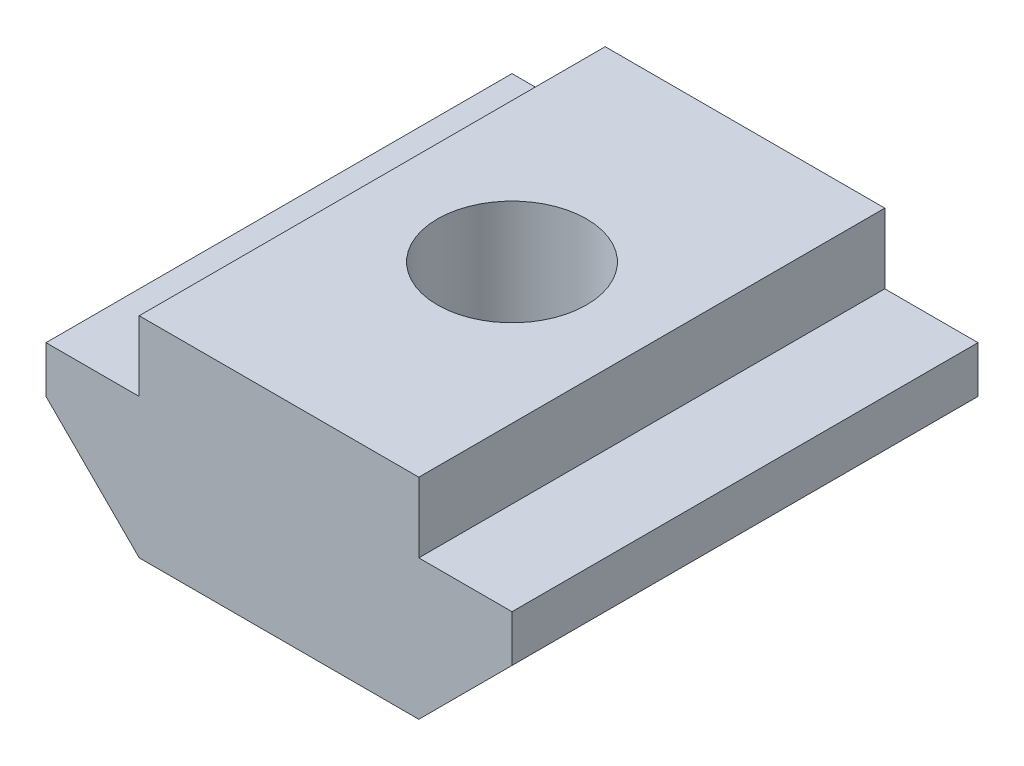
ISO-10303-21;
HEADER;
FILE_DESCRIPTION(('STEP AP214'),'2;1');
FILE_NAME('part.step','',(''),(''),'','','');
FILE_SCHEMA(('AUTOMOTIVE_DESIGN { 1 0 10303 214 1 1 1 1 }'));
ENDSEC;
DATA;
#1=APPLICATION_CONTEXT('core data for automotive mechanical design processes');
#2=APPLICATION_PROTOCOL_DEFINITION('international standard','automotive_design',2000,#1);
#3=PRODUCT_CONTEXT('',#1,'mechanical');
#4=PRODUCT('Part','Part','',(#3));
#5=PRODUCT_RELATED_PRODUCT_CATEGORY('part','',(#4));
#6=PRODUCT_DEFINITION_FORMATION('','',#4);
#7=PRODUCT_DEFINITION_CONTEXT('part definition',#1,'design');
#8=PRODUCT_DEFINITION('design','',#6,#7);
#9=PRODUCT_DEFINITION_SHAPE('','',#8);
#10=(LENGTH_UNIT() NAMED_UNIT(*) SI_UNIT(.MILLI.,.METRE.));
#11=(NAMED_UNIT(*) PLANE_ANGLE_UNIT() SI_UNIT($,.RADIAN.));
#12=(NAMED_UNIT(*) SI_UNIT($,.STERADIAN.) SOLID_ANGLE_UNIT());
#13=UNCERTAINTY_MEASURE_WITH_UNIT(LENGTH_MEASURE(1.E-05),#10,'distance_accuracy_value','');
#14=(GEOMETRIC_REPRESENTATION_CONTEXT(3) GLOBAL_UNCERTAINTY_ASSIGNED_CONTEXT((#13)) GLOBAL_UNIT_ASSIGNED_CONTEXT((#10,
#11,#12)) REPRESENTATION_CONTEXT('',''));
#15=CARTESIAN_POINT('',(0.,0.,0.));
#16=DIRECTION('',(0.,0.,1.));
#17=DIRECTION('',(1.,0.,0.));
#18=AXIS2_PLACEMENT_3D('',#15,#16,#17);
#19=CARTESIAN_POINT('',(0.,0.,-5.));
#20=DIRECTION('',(0.,0.,1.));
#21=DIRECTION('',(1.,0.,0.));
#22=AXIS2_PLACEMENT_3D('',#19,#20,#21);
#23=PLANE('',#22);
#24=DIRECTION('',(1.,0.,0.));
#25=VECTOR('',#24,1.);
#26=CARTESIAN_POINT('',(-5.,-1.5,-5.));
#27=LINE('',#26,#25);
#28=CARTESIAN_POINT('',(-2.99999999999999,-1.5,-5.));
#29=VERTEX_POINT('',#28);
#30=CARTESIAN_POINT('',(2.99999999999999,-1.5,-5.));
#31=VERTEX_POINT('',#30);
#32=EDGE_CURVE('E170',#29,#31,#27,.T.);
#33=ORIENTED_EDGE('',*,*,#32,.F.);
#34=DIRECTION('',(0.707106781186547,-0.707106781186548,0.));
#35=VECTOR('',#34,1.);
#36=CARTESIAN_POINT('',(-2.99999999999999,-1.5,-5.));
#37=LINE('',#36,#35);
#38=CARTESIAN_POINT('',(-5.,0.500000000000008,-5.));
#39=VERTEX_POINT('',#38);
#40=EDGE_CURVE('E211',#29,#39,#37,.F.);
#41=ORIENTED_EDGE('',*,*,#40,.T.);
#42=DIRECTION('',(0.,-1.,0.));
#43=VECTOR('',#42,1.);
#44=CARTESIAN_POINT('',(-5.,1.5,-5.));
#45=LINE('',#44,#43);
#46=CARTESIAN_POINT('',(-5.,1.5,-5.));
#47=VERTEX_POINT('',#46);
#48=EDGE_CURVE('E168',#47,#39,#45,.T.);
#49=ORIENTED_EDGE('',*,*,#48,.F.);
#50=DIRECTION('',(1.,0.,0.));
#51=VECTOR('',#50,1.);
#52=CARTESIAN_POINT('',(-5.,1.5,-5.));
#53=LINE('',#52,#51);
#54=CARTESIAN_POINT('',(-3.,1.5,-5.));
#55=VERTEX_POINT('',#54);
#56=EDGE_CURVE('E176',#47,#55,#53,.T.);
#57=ORIENTED_EDGE('',*,*,#56,.T.);
#58=DIRECTION('',(0.,-1.,0.));
#59=VECTOR('',#58,1.);
#60=CARTESIAN_POINT('',(-3.,3.,-5.));
#61=LINE('',#60,#59);
#62=CARTESIAN_POINT('',(-3.,3.,-5.));
#63=VERTEX_POINT('',#62);
#64=EDGE_CURVE('E190',#63,#55,#61,.T.);
#65=ORIENTED_EDGE('',*,*,#64,.F.);
#66=DIRECTION('',(1.,0.,0.));
#67=VECTOR('',#66,1.);
#68=CARTESIAN_POINT('',(-3.,3.,-5.));
#69=LINE('',#68,#67);
#70=CARTESIAN_POINT('',(3.,3.,-5.));
#71=VERTEX_POINT('',#70);
#72=EDGE_CURVE('E184',#63,#71,#69,.T.);
#73=ORIENTED_EDGE('',*,*,#72,.T.);
#74=DIRECTION('',(0.,-1.,0.));
#75=VECTOR('',#74,1.);
#76=CARTESIAN_POINT('',(3.,3.,-5.));
#77=LINE('',#76,#75);
#78=CARTESIAN_POINT('',(3.,1.5,-5.));
#79=VERTEX_POINT('',#78);
#80=EDGE_CURVE('E193',#71,#79,#77,.T.);
#81=ORIENTED_EDGE('',*,*,#80,.T.);
#82=CARTESIAN_POINT('',(5.,1.5,-5.));
#83=VERTEX_POINT('',#82);
#84=EDGE_CURVE('E175',#79,#83,#53,.T.);
#85=ORIENTED_EDGE('',*,*,#84,.T.);
#86=DIRECTION('',(0.,-1.,0.));
#87=VECTOR('',#86,1.);
#88=CARTESIAN_POINT('',(5.,1.5,-5.));
#89=LINE('',#88,#87);
#90=CARTESIAN_POINT('',(5.,0.500000000000002,-5.));
#91=VERTEX_POINT('',#90);
#92=EDGE_CURVE('E157',#83,#91,#89,.T.);
#93=ORIENTED_EDGE('',*,*,#92,.T.);
#94=DIRECTION('',(-0.707106781186549,-0.707106781186546,0.));
#95=VECTOR('',#94,1.);
#96=CARTESIAN_POINT('',(5.,0.500000000000002,-5.));
#97=LINE('',#96,#95);
#98=EDGE_CURVE('E209',#91,#31,#97,.T.);
#99=ORIENTED_EDGE('',*,*,#98,.T.);
#100=EDGE_LOOP('',(#33,#41,#49,#57,#65,#73,#81,#85,#93,#99));
#101=FACE_BOUND('',#100,.T.);
#102=ADVANCED_FACE('F60',(#101),#23,.F.);
#103=CARTESIAN_POINT('',(0.,0.,5.));
#104=DIRECTION('',(0.,0.,1.));
#105=DIRECTION('',(1.,0.,0.));
#106=AXIS2_PLACEMENT_3D('',#103,#104,#105);
#107=PLANE('',#106);
#108=DIRECTION('',(0.,-1.,0.));
#109=VECTOR('',#108,1.);
#110=CARTESIAN_POINT('',(-5.,1.5,5.));
#111=LINE('',#110,#109);
#112=CARTESIAN_POINT('',(-5.,1.5,5.));
#113=VERTEX_POINT('',#112);
#114=CARTESIAN_POINT('',(-5.,0.500000000000008,5.));
#115=VERTEX_POINT('',#114);
#116=EDGE_CURVE('E163',#113,#115,#111,.T.);
#117=ORIENTED_EDGE('',*,*,#116,.T.);
#118=DIRECTION('',(-0.707106781186547,0.707106781186548,0.));
#119=VECTOR('',#118,1.);
#120=CARTESIAN_POINT('',(-2.25,-2.25,5.));
#121=LINE('',#120,#119);
#122=CARTESIAN_POINT('',(-2.99999999999999,-1.5,5.));
#123=VERTEX_POINT('',#122);
#124=EDGE_CURVE('E68',#115,#123,#121,.F.);
#125=ORIENTED_EDGE('',*,*,#124,.T.);
#126=DIRECTION('',(1.,0.,0.));
#127=VECTOR('',#126,1.);
#128=CARTESIAN_POINT('',(-5.,-1.5,5.));
#129=LINE('',#128,#127);
#130=CARTESIAN_POINT('',(2.99999999999999,-1.5,5.));
#131=VERTEX_POINT('',#130);
#132=EDGE_CURVE('E161',#123,#131,#129,.T.);
#133=ORIENTED_EDGE('',*,*,#132,.T.);
#134=DIRECTION('',(0.707106781186549,0.707106781186546,0.));
#135=VECTOR('',#134,1.);
#136=CARTESIAN_POINT('',(2.24999999999999,-2.25,5.));
#137=LINE('',#136,#135);
#138=CARTESIAN_POINT('',(5.,0.500000000000002,5.));
#139=VERTEX_POINT('',#138);
#140=EDGE_CURVE('E75',#131,#139,#137,.T.);
#141=ORIENTED_EDGE('',*,*,#140,.T.);
#142=DIRECTION('',(0.,-1.,0.));
#143=VECTOR('',#142,1.);
#144=CARTESIAN_POINT('',(5.,1.5,5.));
#145=LINE('',#144,#143);
#146=CARTESIAN_POINT('',(5.,1.5,5.));
#147=VERTEX_POINT('',#146);
#148=EDGE_CURVE('E151',#147,#139,#145,.T.);
#149=ORIENTED_EDGE('',*,*,#148,.F.);
#150=DIRECTION('',(1.,0.,0.));
#151=VECTOR('',#150,1.);
#152=CARTESIAN_POINT('',(-5.,1.5,5.));
#153=LINE('',#152,#151);
#154=CARTESIAN_POINT('',(3.,1.5,5.));
#155=VERTEX_POINT('',#154);
#156=EDGE_CURVE('E141',#155,#147,#153,.T.);
#157=ORIENTED_EDGE('',*,*,#156,.F.);
#158=DIRECTION('',(0.,-1.,0.));
#159=VECTOR('',#158,1.);
#160=CARTESIAN_POINT('',(3.,3.,5.));
#161=LINE('',#160,#159);
#162=CARTESIAN_POINT('',(3.,3.,5.));
#163=VERTEX_POINT('',#162);
#164=EDGE_CURVE('E183',#163,#155,#161,.T.);
#165=ORIENTED_EDGE('',*,*,#164,.F.);
#166=DIRECTION('',(1.,0.,0.));
#167=VECTOR('',#166,1.);
#168=CARTESIAN_POINT('',(-3.,3.,5.));
#169=LINE('',#168,#167);
#170=CARTESIAN_POINT('',(-3.,3.,5.));
#171=VERTEX_POINT('',#170);
#172=EDGE_CURVE('E186',#171,#163,#169,.T.);
#173=ORIENTED_EDGE('',*,*,#172,.F.);
#174=DIRECTION('',(0.,-1.,0.));
#175=VECTOR('',#174,1.);
#176=CARTESIAN_POINT('',(-3.,3.,5.));
#177=LINE('',#176,#175);
#178=CARTESIAN_POINT('',(-3.,1.5,5.));
#179=VERTEX_POINT('',#178);
#180=EDGE_CURVE('E180',#171,#179,#177,.T.);
#181=ORIENTED_EDGE('',*,*,#180,.T.);
#182=EDGE_CURVE('E150',#113,#179,#153,.T.);
#183=ORIENTED_EDGE('',*,*,#182,.F.);
#184=EDGE_LOOP('',(#117,#125,#133,#141,#149,#157,#165,#173,#181,#183));
#185=FACE_BOUND('',#184,.T.);
#186=ADVANCED_FACE('F160',(#185),#107,.T.);
#187=CARTESIAN_POINT('',(-5.,1.5,5.));
#188=DIRECTION('',(0.,1.,0.));
#189=DIRECTION('',(-1.,0.,0.));
#190=AXIS2_PLACEMENT_3D('',#187,#188,#189);
#191=PLANE('',#190);
#192=ORIENTED_EDGE('',*,*,#182,.T.);
#193=DIRECTION('',(0.,0.,-1.));
#194=VECTOR('',#193,1.);
#195=CARTESIAN_POINT('',(-3.,1.5,5.));
#196=LINE('',#195,#194);
#197=EDGE_CURVE('E202',#179,#55,#196,.T.);
#198=ORIENTED_EDGE('',*,*,#197,.T.);
#199=ORIENTED_EDGE('',*,*,#56,.F.);
#200=DIRECTION('',(0.,0.,-1.));
#201=VECTOR('',#200,1.);
#202=CARTESIAN_POINT('',(-5.,1.5,5.));
#203=LINE('',#202,#201);
#204=EDGE_CURVE('E158',#113,#47,#203,.T.);
#205=ORIENTED_EDGE('',*,*,#204,.F.);
#206=EDGE_LOOP('',(#192,#198,#199,#205));
#207=FACE_BOUND('',#206,.T.);
#208=ADVANCED_FACE('F229',(#207),#191,.T.);
#209=CARTESIAN_POINT('',(-5.,1.5,5.));
#210=DIRECTION('',(1.,0.,0.));
#211=DIRECTION('',(0.,1.,0.));
#212=AXIS2_PLACEMENT_3D('',#209,#210,#211);
#213=PLANE('',#212);
#214=ORIENTED_EDGE('',*,*,#48,.T.);
#215=DIRECTION('',(0.,0.,1.));
#216=VECTOR('',#215,1.);
#217=CARTESIAN_POINT('',(-5.,0.500000000000008,5.));
#218=LINE('',#217,#216);
#219=EDGE_CURVE('E83',#39,#115,#218,.T.);
#220=ORIENTED_EDGE('',*,*,#219,.T.);
#221=ORIENTED_EDGE('',*,*,#116,.F.);
#222=ORIENTED_EDGE('',*,*,#204,.T.);
#223=EDGE_LOOP('',(#214,#220,#221,#222));
#224=FACE_BOUND('',#223,.T.);
#225=ADVANCED_FACE('F227',(#224),#213,.F.);
#226=CARTESIAN_POINT('',(-5.,-1.5,5.));
#227=DIRECTION('',(0.,1.,0.));
#228=DIRECTION('',(-1.,0.,0.));
#229=AXIS2_PLACEMENT_3D('',#226,#227,#228);
#230=PLANE('',#229);
#231=CARTESIAN_POINT('',(0.,-1.5,0.));
#232=DIRECTION('',(0.,1.,0.));
#233=DIRECTION('',(-1.,0.,0.));
#234=AXIS2_PLACEMENT_3D('',#231,#232,#233);
#235=CIRCLE('',#234,1.6);
#236=CARTESIAN_POINT('',(-1.6,-1.5,0.));
#237=VERTEX_POINT('',#236);
#238=EDGE_CURVE('E194',#237,#237,#235,.T.);
#239=ORIENTED_EDGE('',*,*,#238,.T.);
#240=EDGE_LOOP('',(#239));
#241=FACE_BOUND('',#240,.T.);
#242=ORIENTED_EDGE('',*,*,#132,.F.);
#243=DIRECTION('',(0.,0.,-1.));
#244=VECTOR('',#243,1.);
#245=CARTESIAN_POINT('',(-2.99999999999999,-1.5,5.));
#246=LINE('',#245,#244);
#247=EDGE_CURVE('E206',#123,#29,#246,.T.);
#248=ORIENTED_EDGE('',*,*,#247,.T.);
#249=ORIENTED_EDGE('',*,*,#32,.T.);
#250=DIRECTION('',(0.,0.,1.));
#251=VECTOR('',#250,1.);
#252=CARTESIAN_POINT('',(2.99999999999999,-1.5,5.));
#253=LINE('',#252,#251);
#254=EDGE_CURVE('E204',#31,#131,#253,.T.);
#255=ORIENTED_EDGE('',*,*,#254,.T.);
#256=EDGE_LOOP('',(#242,#248,#249,#255));
#257=FACE_BOUND('',#256,.T.);
#258=ADVANCED_FACE('F220',(#241,#257),#230,.F.);
#259=CARTESIAN_POINT('',(5.,1.5,5.));
#260=DIRECTION('',(1.,0.,0.));
#261=DIRECTION('',(0.,1.,0.));
#262=AXIS2_PLACEMENT_3D('',#259,#260,#261);
#263=PLANE('',#262);
#264=ORIENTED_EDGE('',*,*,#148,.T.);
#265=DIRECTION('',(0.,0.,-1.));
#266=VECTOR('',#265,1.);
#267=CARTESIAN_POINT('',(5.,0.500000000000002,-5.));
#268=LINE('',#267,#266);
#269=EDGE_CURVE('E12',#139,#91,#268,.T.);
#270=ORIENTED_EDGE('',*,*,#269,.T.);
#271=ORIENTED_EDGE('',*,*,#92,.F.);
#272=DIRECTION('',(0.,0.,-1.));
#273=VECTOR('',#272,1.);
#274=CARTESIAN_POINT('',(5.,1.5,5.));
#275=LINE('',#274,#273);
#276=EDGE_CURVE('E145',#147,#83,#275,.T.);
#277=ORIENTED_EDGE('',*,*,#276,.F.);
#278=EDGE_LOOP('',(#264,#270,#271,#277));
#279=FACE_BOUND('',#278,.T.);
#280=ADVANCED_FACE('F154',(#279),#263,.T.);
#281=DIRECTION('',(0.,0.,-1.));
#282=VECTOR('',#281,1.);
#283=CARTESIAN_POINT('',(3.,1.5,5.));
#284=LINE('',#283,#282);
#285=EDGE_CURVE('E147',#155,#79,#284,.T.);
#286=ORIENTED_EDGE('',*,*,#285,.F.);
#287=ORIENTED_EDGE('',*,*,#156,.T.);
#288=ORIENTED_EDGE('',*,*,#276,.T.);
#289=ORIENTED_EDGE('',*,*,#84,.F.);
#290=EDGE_LOOP('',(#286,#287,#288,#289));
#291=FACE_BOUND('',#290,.T.);
#292=ADVANCED_FACE('F143',(#291),#191,.T.);
#293=CARTESIAN_POINT('',(3.,3.,5.));
#294=DIRECTION('',(1.,0.,0.));
#295=DIRECTION('',(0.,1.,0.));
#296=AXIS2_PLACEMENT_3D('',#293,#294,#295);
#297=PLANE('',#296);
#298=ORIENTED_EDGE('',*,*,#164,.T.);
#299=ORIENTED_EDGE('',*,*,#285,.T.);
#300=ORIENTED_EDGE('',*,*,#80,.F.);
#301=DIRECTION('',(0.,0.,-1.));
#302=VECTOR('',#301,1.);
#303=CARTESIAN_POINT('',(3.,3.,5.));
#304=LINE('',#303,#302);
#305=EDGE_CURVE('E171',#163,#71,#304,.T.);
#306=ORIENTED_EDGE('',*,*,#305,.F.);
#307=EDGE_LOOP('',(#298,#299,#300,#306));
#308=FACE_BOUND('',#307,.T.);
#309=ADVANCED_FACE('F239',(#308),#297,.T.);
#310=CARTESIAN_POINT('',(-3.,3.,5.));
#311=DIRECTION('',(0.,1.,0.));
#312=DIRECTION('',(0.,0.,1.));
#313=AXIS2_PLACEMENT_3D('',#310,#311,#312);
#314=PLANE('',#313);
#315=CARTESIAN_POINT('',(0.,3.,0.));
#316=DIRECTION('',(0.,1.,0.));
#317=DIRECTION('',(0.,0.,1.));
#318=AXIS2_PLACEMENT_3D('',#315,#316,#317);
#319=CIRCLE('',#318,1.6);
#320=CARTESIAN_POINT('',(0.,3.,1.6));
#321=VERTEX_POINT('',#320);
#322=EDGE_CURVE('E288',#321,#321,#319,.T.);
#323=ORIENTED_EDGE('',*,*,#322,.F.);
#324=EDGE_LOOP('',(#323));
#325=FACE_BOUND('',#324,.T.);
#326=ORIENTED_EDGE('',*,*,#72,.F.);
#327=DIRECTION('',(0.,0.,-1.));
#328=VECTOR('',#327,1.);
#329=CARTESIAN_POINT('',(-3.,3.,5.));
#330=LINE('',#329,#328);
#331=EDGE_CURVE('E189',#171,#63,#330,.T.);
#332=ORIENTED_EDGE('',*,*,#331,.F.);
#333=ORIENTED_EDGE('',*,*,#172,.T.);
#334=ORIENTED_EDGE('',*,*,#305,.T.);
#335=EDGE_LOOP('',(#326,#332,#333,#334));
#336=FACE_BOUND('',#335,.T.);
#337=ADVANCED_FACE('F234',(#325,#336),#314,.T.);
#338=CARTESIAN_POINT('',(-3.,3.,5.));
#339=DIRECTION('',(1.,0.,0.));
#340=DIRECTION('',(0.,0.,-1.));
#341=AXIS2_PLACEMENT_3D('',#338,#339,#340);
#342=PLANE('',#341);
#343=ORIENTED_EDGE('',*,*,#197,.F.);
#344=ORIENTED_EDGE('',*,*,#180,.F.);
#345=ORIENTED_EDGE('',*,*,#331,.T.);
#346=ORIENTED_EDGE('',*,*,#64,.T.);
#347=EDGE_LOOP('',(#343,#344,#345,#346));
#348=FACE_BOUND('',#347,.T.);
#349=ADVANCED_FACE('F254',(#348),#342,.F.);
#350=CARTESIAN_POINT('',(0.,-7.,0.));
#351=DIRECTION('',(0.,1.,0.));
#352=DIRECTION('',(0.,0.,1.));
#353=AXIS2_PLACEMENT_3D('',#350,#351,#352);
#354=CYLINDRICAL_SURFACE('',#353,1.6);
#355=ORIENTED_EDGE('',*,*,#322,.T.);
#356=EDGE_LOOP('',(#355));
#357=FACE_BOUND('',#356,.T.);
#358=ORIENTED_EDGE('',*,*,#238,.F.);
#359=EDGE_LOOP('',(#358));
#360=FACE_BOUND('',#359,.T.);
#361=ADVANCED_FACE('F245',(#357,#360),#354,.F.);
#362=CARTESIAN_POINT('',(-2.99999999999999,-1.5,5.));
#363=DIRECTION('',(0.707106781186548,0.707106781186547,0.));
#364=DIRECTION('',(0.,0.,-1.));
#365=AXIS2_PLACEMENT_3D('',#362,#363,#364);
#366=PLANE('',#365);
#367=ORIENTED_EDGE('',*,*,#124,.F.);
#368=ORIENTED_EDGE('',*,*,#219,.F.);
#369=ORIENTED_EDGE('',*,*,#40,.F.);
#370=ORIENTED_EDGE('',*,*,#247,.F.);
#371=EDGE_LOOP('',(#367,#368,#369,#370));
#372=FACE_BOUND('',#371,.T.);
#373=ADVANCED_FACE('F223',(#372),#366,.F.);
#374=CARTESIAN_POINT('',(5.,0.500000000000002,5.));
#375=DIRECTION('',(0.707106781186546,-0.707106781186549,0.));
#376=DIRECTION('',(0.,0.,1.));
#377=AXIS2_PLACEMENT_3D('',#374,#375,#376);
#378=PLANE('',#377);
#379=ORIENTED_EDGE('',*,*,#140,.F.);
#380=ORIENTED_EDGE('',*,*,#254,.F.);
#381=ORIENTED_EDGE('',*,*,#98,.F.);
#382=ORIENTED_EDGE('',*,*,#269,.F.);
#383=EDGE_LOOP('',(#379,#380,#381,#382));
#384=FACE_BOUND('',#383,.T.);
#385=ADVANCED_FACE('F62',(#384),#378,.T.);
#386=CLOSED_SHELL('',(#102,#186,#208,#225,#258,#280,#292,#309,#337,#349,#361,#373,#385));
#387=MANIFOLD_SOLID_BREP('B2',#386);
#388=ADVANCED_BREP_SHAPE_REPRESENTATION('',(#18,#387),#14);
#389=SHAPE_DEFINITION_REPRESENTATION(#9,#388);
ENDSEC;
END-ISO-10303-21;
